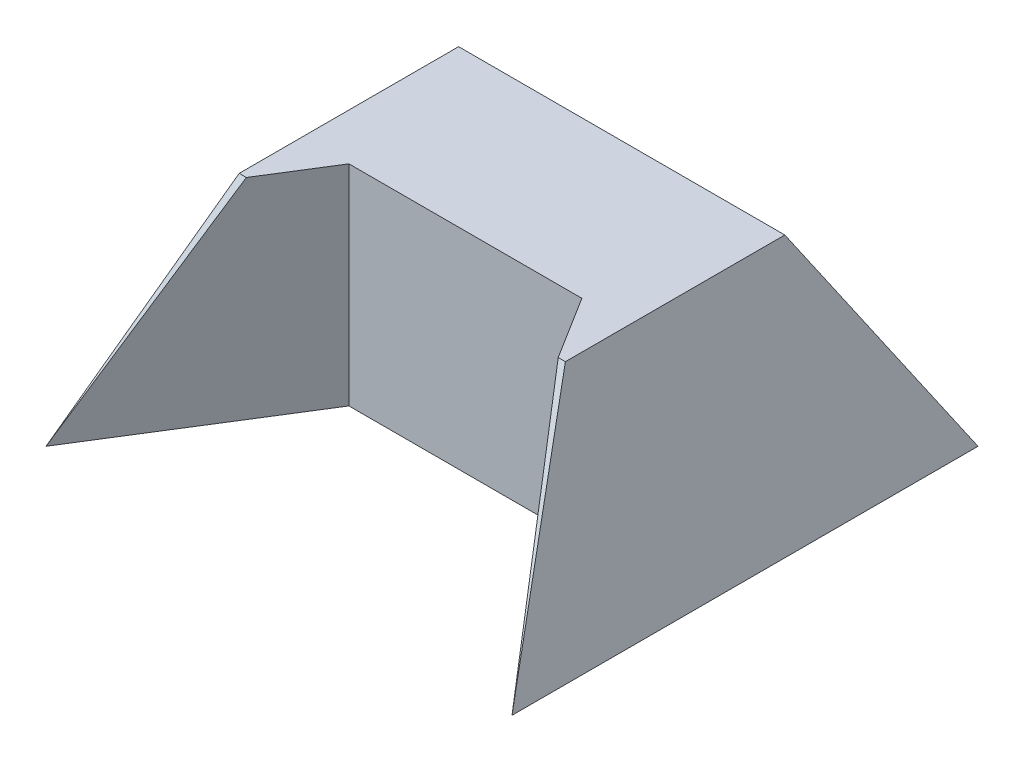
ISO-10303-21;
HEADER;
FILE_DESCRIPTION(('STEP AP214'),'2;1');
FILE_NAME('part.step','',(''),(''),'','','');
FILE_SCHEMA(('AUTOMOTIVE_DESIGN { 1 0 10303 214 1 1 1 1 }'));
ENDSEC;
DATA;
#1=APPLICATION_CONTEXT('core data for automotive mechanical design processes');
#2=APPLICATION_PROTOCOL_DEFINITION('international standard','automotive_design',2000,#1);
#3=PRODUCT_CONTEXT('',#1,'mechanical');
#4=PRODUCT('Part','Part','',(#3));
#5=PRODUCT_RELATED_PRODUCT_CATEGORY('part','',(#4));
#6=PRODUCT_DEFINITION_FORMATION('','',#4);
#7=PRODUCT_DEFINITION_CONTEXT('part definition',#1,'design');
#8=PRODUCT_DEFINITION('design','',#6,#7);
#9=PRODUCT_DEFINITION_SHAPE('','',#8);
#10=(LENGTH_UNIT() NAMED_UNIT(*) SI_UNIT(.MILLI.,.METRE.));
#11=(NAMED_UNIT(*) PLANE_ANGLE_UNIT() SI_UNIT($,.RADIAN.));
#12=(NAMED_UNIT(*) SI_UNIT($,.STERADIAN.) SOLID_ANGLE_UNIT());
#13=UNCERTAINTY_MEASURE_WITH_UNIT(LENGTH_MEASURE(1.E-05),#10,'distance_accuracy_value','');
#14=(GEOMETRIC_REPRESENTATION_CONTEXT(3) GLOBAL_UNCERTAINTY_ASSIGNED_CONTEXT((#13)) GLOBAL_UNIT_ASSIGNED_CONTEXT((#10,
#11,#12)) REPRESENTATION_CONTEXT('',''));
#15=CARTESIAN_POINT('',(0.,0.,0.));
#16=DIRECTION('',(0.,0.,1.));
#17=DIRECTION('',(1.,0.,0.));
#18=AXIS2_PLACEMENT_3D('',#15,#16,#17);
#19=CARTESIAN_POINT('',(100.,0.,0.));
#20=DIRECTION('',(0.,-0.50680946650861,-0.862058098191333));
#21=DIRECTION('',(0.,0.862058098191333,-0.50680946650861));
#22=AXIS2_PLACEMENT_3D('',#19,#20,#21);
#23=PLANE('',#22);
#24=DIRECTION('',(-1.,0.,0.));
#25=VECTOR('',#24,1.);
#26=CARTESIAN_POINT('',(100.,45.,-26.4557876560027));
#27=LINE('',#26,#25);
#28=CARTESIAN_POINT('',(85.,45.,-26.4557876560027));
#29=VERTEX_POINT('',#28);
#30=CARTESIAN_POINT('',(83.4651327149983,45.,-26.4557876560027));
#31=VERTEX_POINT('',#30);
#32=EDGE_CURVE('E138',#29,#31,#27,.T.);
#33=ORIENTED_EDGE('',*,*,#32,.T.);
#34=DIRECTION('',(0.301969032822476,-0.82181527331261,0.483150452515961));
#35=VECTOR('',#34,1.);
#36=CARTESIAN_POINT('',(100.,0.,0.));
#37=LINE('',#36,#35);
#38=CARTESIAN_POINT('',(100.,0.,0.));
#39=VERTEX_POINT('',#38);
#40=EDGE_CURVE('E11',#31,#39,#37,.T.);
#41=ORIENTED_EDGE('',*,*,#40,.T.);
#42=DIRECTION('',(-0.276176659095958,0.828529977287874,-0.487098069905794));
#43=VECTOR('',#42,1.);
#44=CARTESIAN_POINT('',(86.5474882401328,40.3575352796015,-23.726452970595));
#45=LINE('',#44,#43);
#46=EDGE_CURVE('E142',#39,#29,#45,.T.);
#47=ORIENTED_EDGE('',*,*,#46,.T.);
#48=EDGE_LOOP('',(#33,#41,#47));
#49=FACE_BOUND('',#48,.T.);
#50=ADVANCED_FACE('F41',(#49),#23,.F.);
#51=CARTESIAN_POINT('',(15.,45.,-100.));
#52=DIRECTION('',(-0.948683298050514,0.316227766016838,0.));
#53=DIRECTION('',(-0.316227766016838,-0.948683298050514,0.));
#54=AXIS2_PLACEMENT_3D('',#51,#52,#53);
#55=PLANE('',#54);
#56=DIRECTION('',(-0.276176659095958,-0.828529977287874,0.487098069905794));
#57=VECTOR('',#56,1.);
#58=CARTESIAN_POINT('',(24.8935438142779,74.6806314428337,-43.9052206103958));
#59=LINE('',#58,#57);
#60=CARTESIAN_POINT('',(15.,45.,-26.4557876560027));
#61=VERTEX_POINT('',#60);
#62=CARTESIAN_POINT('',(0.,0.,0.));
#63=VERTEX_POINT('',#62);
#64=EDGE_CURVE('E145',#61,#63,#59,.T.);
#65=ORIENTED_EDGE('',*,*,#64,.F.);
#66=DIRECTION('',(0.,0.,1.));
#67=VECTOR('',#66,1.);
#68=CARTESIAN_POINT('',(15.,45.,-100.));
#69=LINE('',#68,#67);
#70=CARTESIAN_POINT('',(15.,45.,-73.5442123439973));
#71=VERTEX_POINT('',#70);
#72=EDGE_CURVE('E164',#71,#61,#69,.T.);
#73=ORIENTED_EDGE('',*,*,#72,.F.);
#74=DIRECTION('',(-0.276176659095958,-0.828529977287874,-0.487098069905794));
#75=VECTOR('',#74,1.);
#76=CARTESIAN_POINT('',(11.4410320544107,34.3230961632322,-79.8212323601993));
#77=LINE('',#76,#75);
#78=CARTESIAN_POINT('',(0.,0.,-100.));
#79=VERTEX_POINT('',#78);
#80=EDGE_CURVE('E155',#71,#79,#77,.T.);
#81=ORIENTED_EDGE('',*,*,#80,.T.);
#82=DIRECTION('',(0.,0.,1.));
#83=VECTOR('',#82,1.);
#84=CARTESIAN_POINT('',(0.,0.,-100.));
#85=LINE('',#84,#83);
#86=EDGE_CURVE('E163',#79,#63,#85,.T.);
#87=ORIENTED_EDGE('',*,*,#86,.T.);
#88=EDGE_LOOP('',(#65,#73,#81,#87));
#89=FACE_BOUND('',#88,.T.);
#90=ADVANCED_FACE('F43',(#89),#55,.T.);
#91=CARTESIAN_POINT('',(85.,45.,-100.));
#92=DIRECTION('',(0.,1.,0.));
#93=DIRECTION('',(-1.,0.,0.));
#94=AXIS2_PLACEMENT_3D('',#91,#92,#93);
#95=PLANE('',#94);
#96=DIRECTION('',(0.52999894000318,0.,0.847998304005088));
#97=VECTOR('',#96,1.);
#98=CARTESIAN_POINT('',(100.,45.,0.));
#99=LINE('',#98,#97);
#100=CARTESIAN_POINT('',(75.,45.,-40.));
#101=VERTEX_POINT('',#100);
#102=EDGE_CURVE('E109',#101,#31,#99,.T.);
#103=ORIENTED_EDGE('',*,*,#102,.T.);
#104=ORIENTED_EDGE('',*,*,#32,.F.);
#105=DIRECTION('',(0.,0.,1.));
#106=VECTOR('',#105,1.);
#107=CARTESIAN_POINT('',(85.,45.,-100.));
#108=LINE('',#107,#106);
#109=CARTESIAN_POINT('',(85.,45.,-73.5442123439973));
#110=VERTEX_POINT('',#109);
#111=EDGE_CURVE('E167',#110,#29,#108,.T.);
#112=ORIENTED_EDGE('',*,*,#111,.F.);
#113=DIRECTION('',(-1.,0.,0.));
#114=VECTOR('',#113,1.);
#115=CARTESIAN_POINT('',(100.,45.,-73.5442123439973));
#116=LINE('',#115,#114);
#117=EDGE_CURVE('E149',#110,#71,#116,.T.);
#118=ORIENTED_EDGE('',*,*,#117,.T.);
#119=ORIENTED_EDGE('',*,*,#72,.T.);
#120=CARTESIAN_POINT('',(16.5348672850017,45.,-26.4557876560027));
#121=VERTEX_POINT('',#120);
#122=EDGE_CURVE('E122',#121,#61,#27,.T.);
#123=ORIENTED_EDGE('',*,*,#122,.F.);
#124=DIRECTION('',(0.52999894000318,0.,-0.847998304005088));
#125=VECTOR('',#124,1.);
#126=CARTESIAN_POINT('',(25.,45.,-40.));
#127=LINE('',#126,#125);
#128=CARTESIAN_POINT('',(25.,45.,-40.));
#129=VERTEX_POINT('',#128);
#130=EDGE_CURVE('E57',#121,#129,#127,.T.);
#131=ORIENTED_EDGE('',*,*,#130,.T.);
#132=DIRECTION('',(1.,0.,0.));
#133=VECTOR('',#132,1.);
#134=CARTESIAN_POINT('',(75.,45.,-40.));
#135=LINE('',#134,#133);
#136=EDGE_CURVE('E112',#129,#101,#135,.T.);
#137=ORIENTED_EDGE('',*,*,#136,.T.);
#138=EDGE_LOOP('',(#103,#104,#112,#118,#119,#123,#131,#137));
#139=FACE_BOUND('',#138,.T.);
#140=ADVANCED_FACE('F120',(#139),#95,.T.);
#141=CARTESIAN_POINT('',(100.,0.,-100.));
#142=DIRECTION('',(0.948683298050514,0.316227766016838,0.));
#143=DIRECTION('',(-0.316227766016838,0.948683298050514,0.));
#144=AXIS2_PLACEMENT_3D('',#141,#142,#143);
#145=PLANE('',#144);
#146=ORIENTED_EDGE('',*,*,#46,.F.);
#147=DIRECTION('',(0.,0.,1.));
#148=VECTOR('',#147,1.);
#149=CARTESIAN_POINT('',(100.,0.,-100.));
#150=LINE('',#149,#148);
#151=CARTESIAN_POINT('',(100.,0.,-100.));
#152=VERTEX_POINT('',#151);
#153=EDGE_CURVE('E171',#152,#39,#150,.T.);
#154=ORIENTED_EDGE('',*,*,#153,.F.);
#155=DIRECTION('',(-0.276176659095958,0.828529977287874,0.487098069905794));
#156=VECTOR('',#155,1.);
#157=CARTESIAN_POINT('',(100.,0.,-100.));
#158=LINE('',#157,#156);
#159=EDGE_CURVE('E65',#152,#110,#158,.T.);
#160=ORIENTED_EDGE('',*,*,#159,.T.);
#161=ORIENTED_EDGE('',*,*,#111,.T.);
#162=EDGE_LOOP('',(#146,#154,#160,#161));
#163=FACE_BOUND('',#162,.T.);
#164=ADVANCED_FACE('F191',(#163),#145,.T.);
#165=CARTESIAN_POINT('',(0.,0.,-100.));
#166=DIRECTION('',(0.,-1.,0.));
#167=DIRECTION('',(0.,0.,-1.));
#168=AXIS2_PLACEMENT_3D('',#165,#166,#167);
#169=PLANE('',#168);
#170=DIRECTION('',(0.52999894000318,0.,0.847998304005088));
#171=VECTOR('',#170,1.);
#172=CARTESIAN_POINT('',(100.,0.,0.));
#173=LINE('',#172,#171);
#174=CARTESIAN_POINT('',(75.,0.,-40.));
#175=VERTEX_POINT('',#174);
#176=EDGE_CURVE('E124',#175,#39,#173,.T.);
#177=ORIENTED_EDGE('',*,*,#176,.F.);
#178=DIRECTION('',(1.,0.,0.));
#179=VECTOR('',#178,1.);
#180=CARTESIAN_POINT('',(75.,0.,-40.));
#181=LINE('',#180,#179);
#182=CARTESIAN_POINT('',(25.,0.,-40.));
#183=VERTEX_POINT('',#182);
#184=EDGE_CURVE('E127',#183,#175,#181,.T.);
#185=ORIENTED_EDGE('',*,*,#184,.F.);
#186=DIRECTION('',(0.52999894000318,0.,-0.847998304005088));
#187=VECTOR('',#186,1.);
#188=CARTESIAN_POINT('',(25.,0.,-40.));
#189=LINE('',#188,#187);
#190=EDGE_CURVE('E103',#63,#183,#189,.T.);
#191=ORIENTED_EDGE('',*,*,#190,.F.);
#192=ORIENTED_EDGE('',*,*,#86,.F.);
#193=DIRECTION('',(1.,0.,0.));
#194=VECTOR('',#193,1.);
#195=CARTESIAN_POINT('',(0.,0.,-100.));
#196=LINE('',#195,#194);
#197=EDGE_CURVE('E159',#79,#152,#196,.T.);
#198=ORIENTED_EDGE('',*,*,#197,.T.);
#199=ORIENTED_EDGE('',*,*,#153,.T.);
#200=EDGE_LOOP('',(#177,#185,#191,#192,#198,#199));
#201=FACE_BOUND('',#200,.T.);
#202=ADVANCED_FACE('F184',(#201),#169,.T.);
#203=CARTESIAN_POINT('',(100.,0.,-100.));
#204=DIRECTION('',(0.,0.50680946650861,-0.862058098191333));
#205=DIRECTION('',(0.,0.862058098191333,0.50680946650861));
#206=AXIS2_PLACEMENT_3D('',#203,#204,#205);
#207=PLANE('',#206);
#208=ORIENTED_EDGE('',*,*,#117,.F.);
#209=ORIENTED_EDGE('',*,*,#159,.F.);
#210=ORIENTED_EDGE('',*,*,#197,.F.);
#211=ORIENTED_EDGE('',*,*,#80,.F.);
#212=EDGE_LOOP('',(#208,#209,#210,#211));
#213=FACE_BOUND('',#212,.T.);
#214=ADVANCED_FACE('F195',(#213),#207,.T.);
#215=ORIENTED_EDGE('',*,*,#64,.T.);
#216=DIRECTION('',(0.301969032822476,0.82181527331261,-0.483150452515961));
#217=VECTOR('',#216,1.);
#218=CARTESIAN_POINT('',(9.11852967837415,24.8162763240948,-14.5896474853986));
#219=LINE('',#218,#217);
#220=EDGE_CURVE('E50',#63,#121,#219,.T.);
#221=ORIENTED_EDGE('',*,*,#220,.T.);
#222=ORIENTED_EDGE('',*,*,#122,.T.);
#223=EDGE_LOOP('',(#215,#221,#222));
#224=FACE_BOUND('',#223,.T.);
#225=ADVANCED_FACE('F179',(#224),#23,.F.);
#226=CARTESIAN_POINT('',(100.,45.,0.));
#227=DIRECTION('',(0.847998304005088,0.,-0.52999894000318));
#228=DIRECTION('',(-0.52999894000318,0.,-0.847998304005088));
#229=AXIS2_PLACEMENT_3D('',#226,#227,#228);
#230=PLANE('',#229);
#231=ORIENTED_EDGE('',*,*,#102,.F.);
#232=DIRECTION('',(0.,-1.,0.));
#233=VECTOR('',#232,1.);
#234=CARTESIAN_POINT('',(75.,45.,-40.));
#235=LINE('',#234,#233);
#236=EDGE_CURVE('E108',#101,#175,#235,.T.);
#237=ORIENTED_EDGE('',*,*,#236,.T.);
#238=ORIENTED_EDGE('',*,*,#176,.T.);
#239=ORIENTED_EDGE('',*,*,#40,.F.);
#240=EDGE_LOOP('',(#231,#237,#238,#239));
#241=FACE_BOUND('',#240,.T.);
#242=ADVANCED_FACE('F186',(#241),#230,.F.);
#243=CARTESIAN_POINT('',(25.,45.,-40.));
#244=DIRECTION('',(-0.847998304005088,0.,-0.52999894000318));
#245=DIRECTION('',(-0.52999894000318,0.,0.847998304005088));
#246=AXIS2_PLACEMENT_3D('',#243,#244,#245);
#247=PLANE('',#246);
#248=ORIENTED_EDGE('',*,*,#190,.T.);
#249=DIRECTION('',(0.,-1.,0.));
#250=VECTOR('',#249,1.);
#251=CARTESIAN_POINT('',(25.,45.,-40.));
#252=LINE('',#251,#250);
#253=EDGE_CURVE('E99',#129,#183,#252,.T.);
#254=ORIENTED_EDGE('',*,*,#253,.F.);
#255=ORIENTED_EDGE('',*,*,#130,.F.);
#256=ORIENTED_EDGE('',*,*,#220,.F.);
#257=EDGE_LOOP('',(#248,#254,#255,#256));
#258=FACE_BOUND('',#257,.T.);
#259=ADVANCED_FACE('F101',(#258),#247,.F.);
#260=CARTESIAN_POINT('',(75.,45.,-40.));
#261=DIRECTION('',(0.,0.,-1.));
#262=DIRECTION('',(-1.,0.,0.));
#263=AXIS2_PLACEMENT_3D('',#260,#261,#262);
#264=PLANE('',#263);
#265=ORIENTED_EDGE('',*,*,#184,.T.);
#266=ORIENTED_EDGE('',*,*,#236,.F.);
#267=ORIENTED_EDGE('',*,*,#136,.F.);
#268=ORIENTED_EDGE('',*,*,#253,.T.);
#269=EDGE_LOOP('',(#265,#266,#267,#268));
#270=FACE_BOUND('',#269,.T.);
#271=ADVANCED_FACE('F113',(#270),#264,.F.);
#272=CLOSED_SHELL('',(#50,#90,#140,#164,#202,#214,#225,#242,#259,#271));
#273=MANIFOLD_SOLID_BREP('B2',#272);
#274=ADVANCED_BREP_SHAPE_REPRESENTATION('',(#18,#273),#14);
#275=SHAPE_DEFINITION_REPRESENTATION(#9,#274);
ENDSEC;
END-ISO-10303-21;
